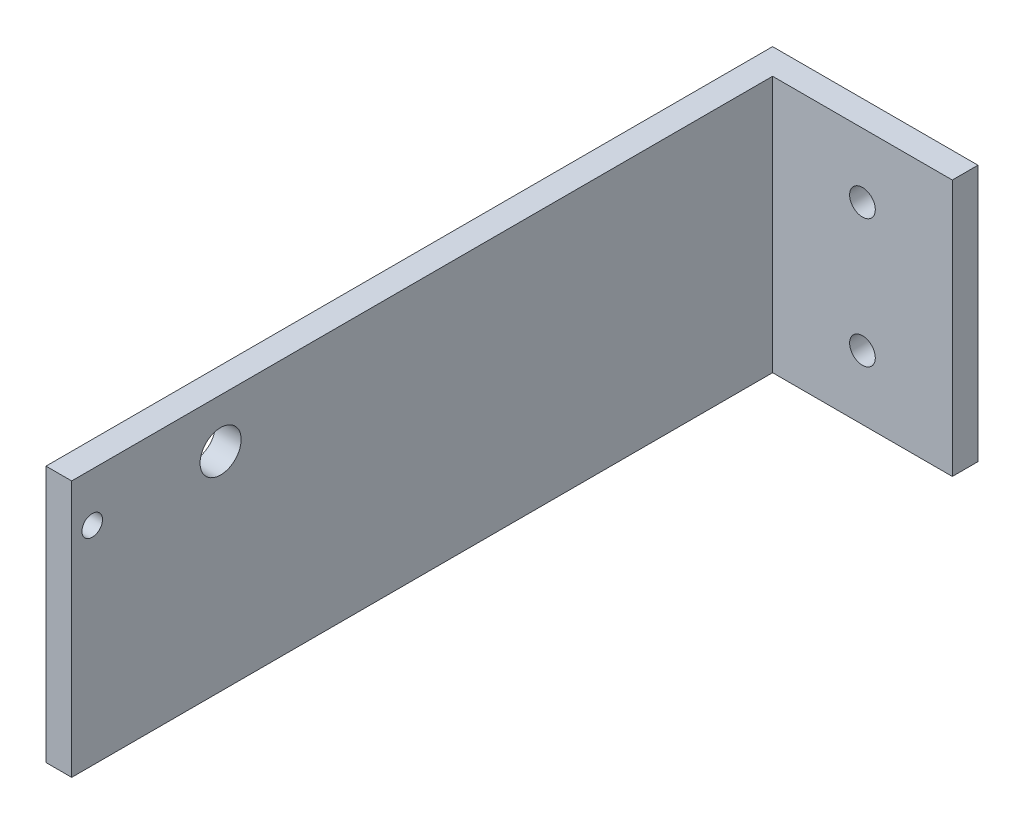
ISO-10303-21;
HEADER;
FILE_DESCRIPTION(('STEP AP214'),'2;1');
FILE_NAME('part.step','',(''),(''),'','','');
FILE_SCHEMA(('AUTOMOTIVE_DESIGN { 1 0 10303 214 1 1 1 1 }'));
ENDSEC;
DATA;
#1=APPLICATION_CONTEXT('core data for automotive mechanical design processes');
#2=APPLICATION_PROTOCOL_DEFINITION('international standard','automotive_design',2000,#1);
#3=PRODUCT_CONTEXT('',#1,'mechanical');
#4=PRODUCT('Part','Part','',(#3));
#5=PRODUCT_RELATED_PRODUCT_CATEGORY('part','',(#4));
#6=PRODUCT_DEFINITION_FORMATION('','',#4);
#7=PRODUCT_DEFINITION_CONTEXT('part definition',#1,'design');
#8=PRODUCT_DEFINITION('design','',#6,#7);
#9=PRODUCT_DEFINITION_SHAPE('','',#8);
#10=(LENGTH_UNIT() NAMED_UNIT(*) SI_UNIT(.MILLI.,.METRE.));
#11=(NAMED_UNIT(*) PLANE_ANGLE_UNIT() SI_UNIT($,.RADIAN.));
#12=(NAMED_UNIT(*) SI_UNIT($,.STERADIAN.) SOLID_ANGLE_UNIT());
#13=UNCERTAINTY_MEASURE_WITH_UNIT(LENGTH_MEASURE(1.E-05),#10,'distance_accuracy_value','');
#14=(GEOMETRIC_REPRESENTATION_CONTEXT(3) GLOBAL_UNCERTAINTY_ASSIGNED_CONTEXT((#13)) GLOBAL_UNIT_ASSIGNED_CONTEXT((#10,
#11,#12)) REPRESENTATION_CONTEXT('',''));
#15=CARTESIAN_POINT('',(0.,0.,0.));
#16=DIRECTION('',(0.,0.,1.));
#17=DIRECTION('',(1.,0.,0.));
#18=AXIS2_PLACEMENT_3D('',#15,#16,#17);
#19=CARTESIAN_POINT('',(0.,25.,-141.5));
#20=DIRECTION('',(1.,0.,0.));
#21=DIRECTION('',(0.,0.,-1.));
#22=AXIS2_PLACEMENT_3D('',#19,#20,#21);
#23=PLANE('',#22);
#24=CARTESIAN_POINT('',(0.,15.5,-4.));
#25=DIRECTION('',(1.,0.,0.));
#26=DIRECTION('',(0.,0.,-1.));
#27=AXIS2_PLACEMENT_3D('',#24,#25,#26);
#28=CIRCLE('',#27,2.);
#29=CARTESIAN_POINT('',(0.,15.5,-6.));
#30=VERTEX_POINT('',#29);
#31=EDGE_CURVE('E121',#30,#30,#28,.F.);
#32=ORIENTED_EDGE('',*,*,#31,.F.);
#33=EDGE_LOOP('',(#32));
#34=FACE_BOUND('',#33,.T.);
#35=CARTESIAN_POINT('',(0.,15.5,-29.));
#36=DIRECTION('',(1.,0.,0.));
#37=DIRECTION('',(0.,0.,-1.));
#38=AXIS2_PLACEMENT_3D('',#35,#36,#37);
#39=CIRCLE('',#38,4.00000000000001);
#40=CARTESIAN_POINT('',(0.,15.5,-33.));
#41=VERTEX_POINT('',#40);
#42=EDGE_CURVE('E167',#41,#41,#39,.F.);
#43=ORIENTED_EDGE('',*,*,#42,.F.);
#44=EDGE_LOOP('',(#43));
#45=FACE_BOUND('',#44,.T.);
#46=DIRECTION('',(0.,0.,1.));
#47=VECTOR('',#46,1.);
#48=CARTESIAN_POINT('',(0.,-25.,-141.5));
#49=LINE('',#48,#47);
#50=CARTESIAN_POINT('',(0.,-25.,-141.5));
#51=VERTEX_POINT('',#50);
#52=CARTESIAN_POINT('',(0.,-25.,0.));
#53=VERTEX_POINT('',#52);
#54=EDGE_CURVE('E117',#51,#53,#49,.T.);
#55=ORIENTED_EDGE('',*,*,#54,.T.);
#56=DIRECTION('',(0.,-1.,0.));
#57=VECTOR('',#56,1.);
#58=CARTESIAN_POINT('',(0.,25.,0.));
#59=LINE('',#58,#57);
#60=CARTESIAN_POINT('',(0.,25.,0.));
#61=VERTEX_POINT('',#60);
#62=EDGE_CURVE('E11',#61,#53,#59,.T.);
#63=ORIENTED_EDGE('',*,*,#62,.F.);
#64=DIRECTION('',(0.,0.,1.));
#65=VECTOR('',#64,1.);
#66=CARTESIAN_POINT('',(0.,25.,-141.5));
#67=LINE('',#66,#65);
#68=CARTESIAN_POINT('',(0.,25.,-141.5));
#69=VERTEX_POINT('',#68);
#70=EDGE_CURVE('E128',#69,#61,#67,.T.);
#71=ORIENTED_EDGE('',*,*,#70,.F.);
#72=DIRECTION('',(0.,-1.,0.));
#73=VECTOR('',#72,1.);
#74=CARTESIAN_POINT('',(0.,25.,-141.5));
#75=LINE('',#74,#73);
#76=EDGE_CURVE('E113',#69,#51,#75,.T.);
#77=ORIENTED_EDGE('',*,*,#76,.T.);
#78=EDGE_LOOP('',(#55,#63,#71,#77));
#79=FACE_BOUND('',#78,.T.);
#80=ADVANCED_FACE('F33',(#34,#45,#79),#23,.F.);
#81=CARTESIAN_POINT('',(0.,25.,0.));
#82=DIRECTION('',(0.,0.,-1.));
#83=DIRECTION('',(-1.,0.,0.));
#84=AXIS2_PLACEMENT_3D('',#81,#82,#83);
#85=PLANE('',#84);
#86=DIRECTION('',(1.,0.,0.));
#87=VECTOR('',#86,1.);
#88=CARTESIAN_POINT('',(0.,-25.,0.));
#89=LINE('',#88,#87);
#90=CARTESIAN_POINT('',(5.,-25.,0.));
#91=VERTEX_POINT('',#90);
#92=EDGE_CURVE('E120',#53,#91,#89,.T.);
#93=ORIENTED_EDGE('',*,*,#92,.T.);
#94=DIRECTION('',(0.,-1.,0.));
#95=VECTOR('',#94,1.);
#96=CARTESIAN_POINT('',(5.,25.,0.));
#97=LINE('',#96,#95);
#98=CARTESIAN_POINT('',(5.,25.,0.));
#99=VERTEX_POINT('',#98);
#100=EDGE_CURVE('E41',#99,#91,#97,.T.);
#101=ORIENTED_EDGE('',*,*,#100,.F.);
#102=DIRECTION('',(1.,0.,0.));
#103=VECTOR('',#102,1.);
#104=CARTESIAN_POINT('',(0.,25.,0.));
#105=LINE('',#104,#103);
#106=EDGE_CURVE('E86',#61,#99,#105,.T.);
#107=ORIENTED_EDGE('',*,*,#106,.F.);
#108=ORIENTED_EDGE('',*,*,#62,.T.);
#109=EDGE_LOOP('',(#93,#101,#107,#108));
#110=FACE_BOUND('',#109,.T.);
#111=ADVANCED_FACE('F157',(#110),#85,.F.);
#112=CARTESIAN_POINT('',(5.,25.,0.));
#113=DIRECTION('',(-1.,0.,0.));
#114=DIRECTION('',(0.,0.,1.));
#115=AXIS2_PLACEMENT_3D('',#112,#113,#114);
#116=PLANE('',#115);
#117=CARTESIAN_POINT('',(5.,15.5,-4.));
#118=DIRECTION('',(1.,0.,0.));
#119=DIRECTION('',(0.,0.,-1.));
#120=AXIS2_PLACEMENT_3D('',#117,#118,#119);
#121=CIRCLE('',#120,2.);
#122=CARTESIAN_POINT('',(5.,15.5,-6.));
#123=VERTEX_POINT('',#122);
#124=EDGE_CURVE('E169',#123,#123,#121,.T.);
#125=ORIENTED_EDGE('',*,*,#124,.F.);
#126=EDGE_LOOP('',(#125));
#127=FACE_BOUND('',#126,.T.);
#128=CARTESIAN_POINT('',(5.,15.5,-29.));
#129=DIRECTION('',(1.,0.,0.));
#130=DIRECTION('',(0.,0.,-1.));
#131=AXIS2_PLACEMENT_3D('',#128,#129,#130);
#132=CIRCLE('',#131,4.00000000000001);
#133=CARTESIAN_POINT('',(5.,15.5,-33.));
#134=VERTEX_POINT('',#133);
#135=EDGE_CURVE('E170',#134,#134,#132,.T.);
#136=ORIENTED_EDGE('',*,*,#135,.F.);
#137=EDGE_LOOP('',(#136));
#138=FACE_BOUND('',#137,.T.);
#139=DIRECTION('',(0.,0.,-1.));
#140=VECTOR('',#139,1.);
#141=CARTESIAN_POINT('',(5.,-25.,0.));
#142=LINE('',#141,#140);
#143=CARTESIAN_POINT('',(5.00000000000002,-25.,-136.5));
#144=VERTEX_POINT('',#143);
#145=EDGE_CURVE('E123',#91,#144,#142,.T.);
#146=ORIENTED_EDGE('',*,*,#145,.T.);
#147=DIRECTION('',(0.,-1.,0.));
#148=VECTOR('',#147,1.);
#149=CARTESIAN_POINT('',(5.00000000000002,25.,-136.5));
#150=LINE('',#149,#148);
#151=CARTESIAN_POINT('',(5.00000000000002,25.,-136.5));
#152=VERTEX_POINT('',#151);
#153=EDGE_CURVE('E108',#152,#144,#150,.T.);
#154=ORIENTED_EDGE('',*,*,#153,.F.);
#155=DIRECTION('',(0.,0.,-1.));
#156=VECTOR('',#155,1.);
#157=CARTESIAN_POINT('',(5.,25.,0.));
#158=LINE('',#157,#156);
#159=EDGE_CURVE('E99',#99,#152,#158,.T.);
#160=ORIENTED_EDGE('',*,*,#159,.F.);
#161=ORIENTED_EDGE('',*,*,#100,.T.);
#162=EDGE_LOOP('',(#146,#154,#160,#161));
#163=FACE_BOUND('',#162,.T.);
#164=ADVANCED_FACE('F134',(#127,#138,#163),#116,.F.);
#165=CARTESIAN_POINT('',(5.00000000000002,25.,-136.5));
#166=DIRECTION('',(0.,0.,-1.));
#167=DIRECTION('',(-1.,0.,0.));
#168=AXIS2_PLACEMENT_3D('',#165,#166,#167);
#169=PLANE('',#168);
#170=CARTESIAN_POINT('',(22.5,12.5,-136.5));
#171=DIRECTION('',(0.,0.,1.));
#172=DIRECTION('',(1.,0.,0.));
#173=AXIS2_PLACEMENT_3D('',#170,#171,#172);
#174=CIRCLE('',#173,2.5);
#175=CARTESIAN_POINT('',(25.,12.5,-136.5));
#176=VERTEX_POINT('',#175);
#177=EDGE_CURVE('E184',#176,#176,#174,.T.);
#178=ORIENTED_EDGE('',*,*,#177,.F.);
#179=EDGE_LOOP('',(#178));
#180=FACE_BOUND('',#179,.T.);
#181=CARTESIAN_POINT('',(22.5,-12.5,-136.5));
#182=DIRECTION('',(0.,0.,1.));
#183=DIRECTION('',(-1.,0.,0.));
#184=AXIS2_PLACEMENT_3D('',#181,#182,#183);
#185=CIRCLE('',#184,2.5);
#186=CARTESIAN_POINT('',(20.,-12.5,-136.5));
#187=VERTEX_POINT('',#186);
#188=EDGE_CURVE('E185',#187,#187,#185,.T.);
#189=ORIENTED_EDGE('',*,*,#188,.F.);
#190=EDGE_LOOP('',(#189));
#191=FACE_BOUND('',#190,.T.);
#192=DIRECTION('',(1.,0.,0.));
#193=VECTOR('',#192,1.);
#194=CARTESIAN_POINT('',(5.00000000000002,-25.,-136.5));
#195=LINE('',#194,#193);
#196=CARTESIAN_POINT('',(40.,-25.,-136.5));
#197=VERTEX_POINT('',#196);
#198=EDGE_CURVE('E107',#144,#197,#195,.T.);
#199=ORIENTED_EDGE('',*,*,#198,.T.);
#200=DIRECTION('',(0.,-1.,0.));
#201=VECTOR('',#200,1.);
#202=CARTESIAN_POINT('',(40.,25.,-136.5));
#203=LINE('',#202,#201);
#204=CARTESIAN_POINT('',(40.,25.,-136.5));
#205=VERTEX_POINT('',#204);
#206=EDGE_CURVE('E104',#205,#197,#203,.T.);
#207=ORIENTED_EDGE('',*,*,#206,.F.);
#208=DIRECTION('',(1.,0.,0.));
#209=VECTOR('',#208,1.);
#210=CARTESIAN_POINT('',(5.00000000000002,25.,-136.5));
#211=LINE('',#210,#209);
#212=EDGE_CURVE('E93',#152,#205,#211,.T.);
#213=ORIENTED_EDGE('',*,*,#212,.F.);
#214=ORIENTED_EDGE('',*,*,#153,.T.);
#215=EDGE_LOOP('',(#199,#207,#213,#214));
#216=FACE_BOUND('',#215,.T.);
#217=ADVANCED_FACE('F105',(#180,#191,#216),#169,.F.);
#218=CARTESIAN_POINT('',(40.,25.,-136.5));
#219=DIRECTION('',(-1.,0.,0.));
#220=DIRECTION('',(0.,0.,1.));
#221=AXIS2_PLACEMENT_3D('',#218,#219,#220);
#222=PLANE('',#221);
#223=DIRECTION('',(0.,0.,-1.));
#224=VECTOR('',#223,1.);
#225=CARTESIAN_POINT('',(40.,-25.,-136.5));
#226=LINE('',#225,#224);
#227=CARTESIAN_POINT('',(40.,-25.,-141.5));
#228=VERTEX_POINT('',#227);
#229=EDGE_CURVE('E72',#197,#228,#226,.T.);
#230=ORIENTED_EDGE('',*,*,#229,.T.);
#231=DIRECTION('',(0.,-1.,0.));
#232=VECTOR('',#231,1.);
#233=CARTESIAN_POINT('',(40.,25.,-141.5));
#234=LINE('',#233,#232);
#235=CARTESIAN_POINT('',(40.,25.,-141.5));
#236=VERTEX_POINT('',#235);
#237=EDGE_CURVE('E109',#236,#228,#234,.T.);
#238=ORIENTED_EDGE('',*,*,#237,.F.);
#239=DIRECTION('',(0.,0.,-1.));
#240=VECTOR('',#239,1.);
#241=CARTESIAN_POINT('',(40.,25.,-136.5));
#242=LINE('',#241,#240);
#243=EDGE_CURVE('E97',#205,#236,#242,.T.);
#244=ORIENTED_EDGE('',*,*,#243,.F.);
#245=ORIENTED_EDGE('',*,*,#206,.T.);
#246=EDGE_LOOP('',(#230,#238,#244,#245));
#247=FACE_BOUND('',#246,.T.);
#248=ADVANCED_FACE('F111',(#247),#222,.F.);
#249=CARTESIAN_POINT('',(40.,25.,-141.5));
#250=DIRECTION('',(0.,0.,1.));
#251=DIRECTION('',(1.,0.,0.));
#252=AXIS2_PLACEMENT_3D('',#249,#250,#251);
#253=PLANE('',#252);
#254=CARTESIAN_POINT('',(22.5,12.5,-141.5));
#255=DIRECTION('',(0.,0.,1.));
#256=DIRECTION('',(1.,0.,0.));
#257=AXIS2_PLACEMENT_3D('',#254,#255,#256);
#258=CIRCLE('',#257,2.5);
#259=CARTESIAN_POINT('',(25.,12.5,-141.5));
#260=VERTEX_POINT('',#259);
#261=EDGE_CURVE('E175',#260,#260,#258,.F.);
#262=ORIENTED_EDGE('',*,*,#261,.F.);
#263=EDGE_LOOP('',(#262));
#264=FACE_BOUND('',#263,.T.);
#265=CARTESIAN_POINT('',(22.5,-12.5,-141.5));
#266=DIRECTION('',(0.,0.,1.));
#267=DIRECTION('',(1.,0.,0.));
#268=AXIS2_PLACEMENT_3D('',#265,#266,#267);
#269=CIRCLE('',#268,2.5);
#270=CARTESIAN_POINT('',(25.,-12.5,-141.5));
#271=VERTEX_POINT('',#270);
#272=EDGE_CURVE('E181',#271,#271,#269,.F.);
#273=ORIENTED_EDGE('',*,*,#272,.F.);
#274=EDGE_LOOP('',(#273));
#275=FACE_BOUND('',#274,.T.);
#276=DIRECTION('',(-1.,0.,0.));
#277=VECTOR('',#276,1.);
#278=CARTESIAN_POINT('',(40.,-25.,-141.5));
#279=LINE('',#278,#277);
#280=EDGE_CURVE('E78',#228,#51,#279,.T.);
#281=ORIENTED_EDGE('',*,*,#280,.T.);
#282=ORIENTED_EDGE('',*,*,#76,.F.);
#283=DIRECTION('',(-1.,0.,0.));
#284=VECTOR('',#283,1.);
#285=CARTESIAN_POINT('',(40.,25.,-141.5));
#286=LINE('',#285,#284);
#287=EDGE_CURVE('E49',#236,#69,#286,.T.);
#288=ORIENTED_EDGE('',*,*,#287,.F.);
#289=ORIENTED_EDGE('',*,*,#237,.T.);
#290=EDGE_LOOP('',(#281,#282,#288,#289));
#291=FACE_BOUND('',#290,.T.);
#292=ADVANCED_FACE('F141',(#264,#275,#291),#253,.F.);
#293=CARTESIAN_POINT('',(0.,25.,0.));
#294=DIRECTION('',(0.,1.,0.));
#295=DIRECTION('',(0.,0.,1.));
#296=AXIS2_PLACEMENT_3D('',#293,#294,#295);
#297=PLANE('',#296);
#298=ORIENTED_EDGE('',*,*,#70,.T.);
#299=ORIENTED_EDGE('',*,*,#106,.T.);
#300=ORIENTED_EDGE('',*,*,#159,.T.);
#301=ORIENTED_EDGE('',*,*,#212,.T.);
#302=ORIENTED_EDGE('',*,*,#243,.T.);
#303=ORIENTED_EDGE('',*,*,#287,.T.);
#304=EDGE_LOOP('',(#298,#299,#300,#301,#302,#303));
#305=FACE_BOUND('',#304,.T.);
#306=ADVANCED_FACE('F95',(#305),#297,.T.);
#307=CARTESIAN_POINT('',(0.,-25.,0.));
#308=DIRECTION('',(0.,1.,0.));
#309=DIRECTION('',(0.,0.,1.));
#310=AXIS2_PLACEMENT_3D('',#307,#308,#309);
#311=PLANE('',#310);
#312=ORIENTED_EDGE('',*,*,#54,.F.);
#313=ORIENTED_EDGE('',*,*,#280,.F.);
#314=ORIENTED_EDGE('',*,*,#229,.F.);
#315=ORIENTED_EDGE('',*,*,#198,.F.);
#316=ORIENTED_EDGE('',*,*,#145,.F.);
#317=ORIENTED_EDGE('',*,*,#92,.F.);
#318=EDGE_LOOP('',(#312,#313,#314,#315,#316,#317));
#319=FACE_BOUND('',#318,.T.);
#320=ADVANCED_FACE('F137',(#319),#311,.F.);
#321=CARTESIAN_POINT('',(-0.00100000000001054,15.5,-29.));
#322=DIRECTION('',(1.,0.,0.));
#323=DIRECTION('',(0.,0.,-1.));
#324=AXIS2_PLACEMENT_3D('',#321,#322,#323);
#325=CYLINDRICAL_SURFACE('',#324,4.00000000000001);
#326=ORIENTED_EDGE('',*,*,#135,.T.);
#327=EDGE_LOOP('',(#326));
#328=FACE_BOUND('',#327,.T.);
#329=ORIENTED_EDGE('',*,*,#42,.T.);
#330=EDGE_LOOP('',(#329));
#331=FACE_BOUND('',#330,.T.);
#332=ADVANCED_FACE('F210',(#328,#331),#325,.F.);
#333=CARTESIAN_POINT('',(-0.00100000000001314,15.5,-4.));
#334=DIRECTION('',(1.,0.,0.));
#335=DIRECTION('',(0.,0.,-1.));
#336=AXIS2_PLACEMENT_3D('',#333,#334,#335);
#337=CYLINDRICAL_SURFACE('',#336,2.);
#338=ORIENTED_EDGE('',*,*,#124,.T.);
#339=EDGE_LOOP('',(#338));
#340=FACE_BOUND('',#339,.T.);
#341=ORIENTED_EDGE('',*,*,#31,.T.);
#342=EDGE_LOOP('',(#341));
#343=FACE_BOUND('',#342,.T.);
#344=ADVANCED_FACE('F203',(#340,#343),#337,.F.);
#345=CARTESIAN_POINT('',(22.5,-12.5,-141.501));
#346=DIRECTION('',(0.,0.,1.));
#347=DIRECTION('',(1.,0.,0.));
#348=AXIS2_PLACEMENT_3D('',#345,#346,#347);
#349=CYLINDRICAL_SURFACE('',#348,2.5);
#350=ORIENTED_EDGE('',*,*,#188,.T.);
#351=EDGE_LOOP('',(#350));
#352=FACE_BOUND('',#351,.T.);
#353=ORIENTED_EDGE('',*,*,#272,.T.);
#354=EDGE_LOOP('',(#353));
#355=FACE_BOUND('',#354,.T.);
#356=ADVANCED_FACE('F200',(#352,#355),#349,.F.);
#357=CARTESIAN_POINT('',(22.5,12.5,-141.501));
#358=DIRECTION('',(0.,0.,1.));
#359=DIRECTION('',(1.,0.,0.));
#360=AXIS2_PLACEMENT_3D('',#357,#358,#359);
#361=CYLINDRICAL_SURFACE('',#360,2.5);
#362=ORIENTED_EDGE('',*,*,#177,.T.);
#363=EDGE_LOOP('',(#362));
#364=FACE_BOUND('',#363,.T.);
#365=ORIENTED_EDGE('',*,*,#261,.T.);
#366=EDGE_LOOP('',(#365));
#367=FACE_BOUND('',#366,.T.);
#368=ADVANCED_FACE('F193',(#364,#367),#361,.F.);
#369=CLOSED_SHELL('',(#80,#111,#164,#217,#248,#292,#306,#320,#332,#344,#356,#368));
#370=MANIFOLD_SOLID_BREP('B2',#369);
#371=ADVANCED_BREP_SHAPE_REPRESENTATION('',(#18,#370),#14);
#372=SHAPE_DEFINITION_REPRESENTATION(#9,#371);
ENDSEC;
END-ISO-10303-21;
